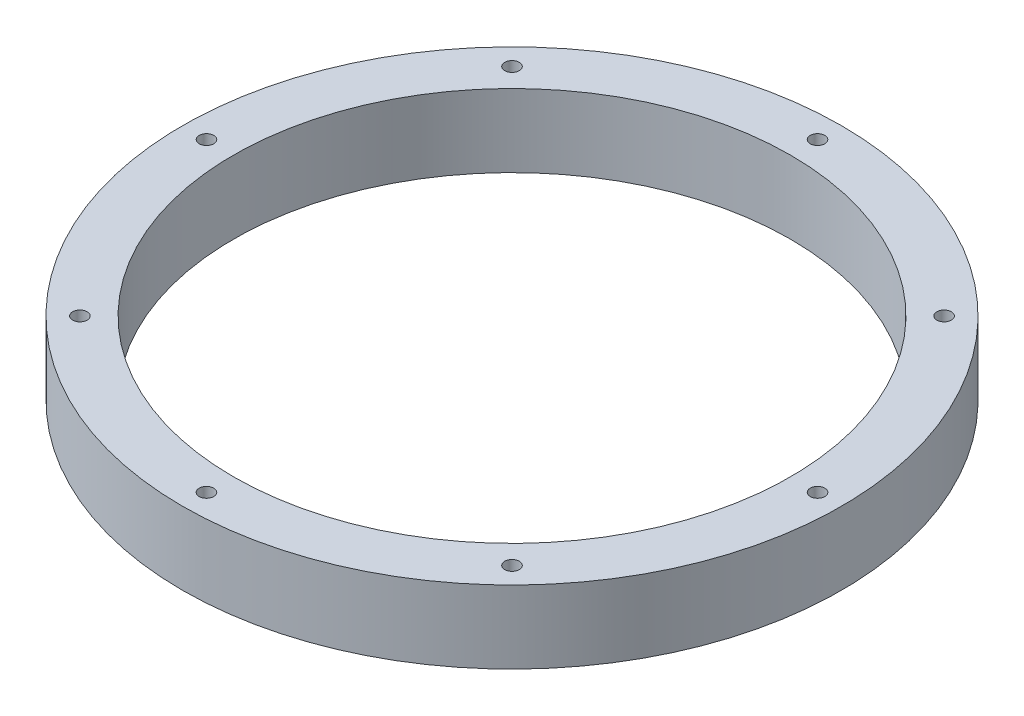
ISO-10303-21;
HEADER;
FILE_DESCRIPTION(('STEP AP214'),'2;1');
FILE_NAME('part.step','',(''),(''),'','','');
FILE_SCHEMA(('AUTOMOTIVE_DESIGN { 1 0 10303 214 1 1 1 1 }'));
ENDSEC;
DATA;
#1=APPLICATION_CONTEXT('core data for automotive mechanical design processes');
#2=APPLICATION_PROTOCOL_DEFINITION('international standard','automotive_design',2000,#1);
#3=PRODUCT_CONTEXT('',#1,'mechanical');
#4=PRODUCT('Part','Part','',(#3));
#5=PRODUCT_RELATED_PRODUCT_CATEGORY('part','',(#4));
#6=PRODUCT_DEFINITION_FORMATION('','',#4);
#7=PRODUCT_DEFINITION_CONTEXT('part definition',#1,'design');
#8=PRODUCT_DEFINITION('design','',#6,#7);
#9=PRODUCT_DEFINITION_SHAPE('','',#8);
#10=(LENGTH_UNIT() NAMED_UNIT(*) SI_UNIT(.MILLI.,.METRE.));
#11=(NAMED_UNIT(*) PLANE_ANGLE_UNIT() SI_UNIT($,.RADIAN.));
#12=(NAMED_UNIT(*) SI_UNIT($,.STERADIAN.) SOLID_ANGLE_UNIT());
#13=UNCERTAINTY_MEASURE_WITH_UNIT(LENGTH_MEASURE(1.E-05),#10,'distance_accuracy_value','');
#14=(GEOMETRIC_REPRESENTATION_CONTEXT(3) GLOBAL_UNCERTAINTY_ASSIGNED_CONTEXT((#13)) GLOBAL_UNIT_ASSIGNED_CONTEXT((#10,
#11,#12)) REPRESENTATION_CONTEXT('',''));
#15=CARTESIAN_POINT('',(0.,0.,0.));
#16=DIRECTION('',(0.,0.,1.));
#17=DIRECTION('',(1.,0.,0.));
#18=AXIS2_PLACEMENT_3D('',#15,#16,#17);
#19=CARTESIAN_POINT('',(0.,0.,0.));
#20=DIRECTION('',(0.,-1.,0.));
#21=DIRECTION('',(0.,0.,-1.));
#22=AXIS2_PLACEMENT_3D('',#19,#20,#21);
#23=CYLINDRICAL_SURFACE('',#22,76.5);
#24=CARTESIAN_POINT('',(0.,0.,0.));
#25=DIRECTION('',(0.,-1.,0.));
#26=DIRECTION('',(0.,0.,-1.));
#27=AXIS2_PLACEMENT_3D('',#24,#25,#26);
#28=CIRCLE('',#27,76.5);
#29=CARTESIAN_POINT('',(0.,0.,-76.5));
#30=VERTEX_POINT('',#29);
#31=EDGE_CURVE('E53',#30,#30,#28,.T.);
#32=ORIENTED_EDGE('',*,*,#31,.T.);
#33=EDGE_LOOP('',(#32));
#34=FACE_BOUND('',#33,.T.);
#35=CARTESIAN_POINT('',(0.,20.,0.));
#36=DIRECTION('',(0.,-1.,0.));
#37=DIRECTION('',(0.,0.,-1.));
#38=AXIS2_PLACEMENT_3D('',#35,#36,#37);
#39=CIRCLE('',#38,76.5);
#40=CARTESIAN_POINT('',(0.,20.,-76.5));
#41=VERTEX_POINT('',#40);
#42=EDGE_CURVE('E10',#41,#41,#39,.T.);
#43=ORIENTED_EDGE('',*,*,#42,.F.);
#44=EDGE_LOOP('',(#43));
#45=FACE_BOUND('',#44,.T.);
#46=ADVANCED_FACE('F39',(#34,#45),#23,.F.);
#47=CARTESIAN_POINT('',(76.5,20.,0.));
#48=DIRECTION('',(0.,1.,0.));
#49=DIRECTION('',(0.,0.,1.));
#50=AXIS2_PLACEMENT_3D('',#47,#48,#49);
#51=PLANE('',#50);
#52=CARTESIAN_POINT('',(-83.9,20.,0.));
#53=DIRECTION('',(0.,1.,0.));
#54=DIRECTION('',(0.,0.,1.));
#55=AXIS2_PLACEMENT_3D('',#52,#53,#54);
#56=CIRCLE('',#55,2.);
#57=CARTESIAN_POINT('',(-83.9,20.,2.));
#58=VERTEX_POINT('',#57);
#59=EDGE_CURVE('E101',#58,#58,#56,.T.);
#60=ORIENTED_EDGE('',*,*,#59,.F.);
#61=EDGE_LOOP('',(#60));
#62=FACE_BOUND('',#61,.T.);
#63=CARTESIAN_POINT('',(-59.3262589415513,20.,-59.3262589415513));
#64=DIRECTION('',(0.,1.,0.));
#65=DIRECTION('',(0.,0.,1.));
#66=AXIS2_PLACEMENT_3D('',#63,#64,#65);
#67=CIRCLE('',#66,2.);
#68=CARTESIAN_POINT('',(-59.3262589415513,20.,-57.3262589415514));
#69=VERTEX_POINT('',#68);
#70=EDGE_CURVE('E98',#69,#69,#67,.T.);
#71=ORIENTED_EDGE('',*,*,#70,.F.);
#72=EDGE_LOOP('',(#71));
#73=FACE_BOUND('',#72,.T.);
#74=CARTESIAN_POINT('',(0.,20.,-83.9));
#75=DIRECTION('',(0.,1.,0.));
#76=DIRECTION('',(0.,0.,1.));
#77=AXIS2_PLACEMENT_3D('',#74,#75,#76);
#78=CIRCLE('',#77,2.);
#79=CARTESIAN_POINT('',(0.,20.,-81.9));
#80=VERTEX_POINT('',#79);
#81=EDGE_CURVE('E92',#80,#80,#78,.T.);
#82=ORIENTED_EDGE('',*,*,#81,.F.);
#83=EDGE_LOOP('',(#82));
#84=FACE_BOUND('',#83,.T.);
#85=CARTESIAN_POINT('',(59.3262589415513,20.,-59.3262589415513));
#86=DIRECTION('',(0.,1.,0.));
#87=DIRECTION('',(0.,0.,1.));
#88=AXIS2_PLACEMENT_3D('',#85,#86,#87);
#89=CIRCLE('',#88,1.99999999999999);
#90=CARTESIAN_POINT('',(59.3262589415513,20.,-57.3262589415514));
#91=VERTEX_POINT('',#90);
#92=EDGE_CURVE('E86',#91,#91,#89,.T.);
#93=ORIENTED_EDGE('',*,*,#92,.F.);
#94=EDGE_LOOP('',(#93));
#95=FACE_BOUND('',#94,.T.);
#96=CARTESIAN_POINT('',(83.9,20.,0.));
#97=DIRECTION('',(0.,1.,0.));
#98=DIRECTION('',(0.,0.,1.));
#99=AXIS2_PLACEMENT_3D('',#96,#97,#98);
#100=CIRCLE('',#99,1.99999999999998);
#101=CARTESIAN_POINT('',(83.9,20.,1.99999999999997));
#102=VERTEX_POINT('',#101);
#103=EDGE_CURVE('E80',#102,#102,#100,.T.);
#104=ORIENTED_EDGE('',*,*,#103,.F.);
#105=EDGE_LOOP('',(#104));
#106=FACE_BOUND('',#105,.T.);
#107=CARTESIAN_POINT('',(59.3262589415514,20.,59.3262589415513));
#108=DIRECTION('',(0.,1.,0.));
#109=DIRECTION('',(0.,0.,1.));
#110=AXIS2_PLACEMENT_3D('',#107,#108,#109);
#111=CIRCLE('',#110,2.);
#112=CARTESIAN_POINT('',(59.3262589415514,20.,61.3262589415513));
#113=VERTEX_POINT('',#112);
#114=EDGE_CURVE('E74',#113,#113,#111,.T.);
#115=ORIENTED_EDGE('',*,*,#114,.F.);
#116=EDGE_LOOP('',(#115));
#117=FACE_BOUND('',#116,.T.);
#118=CARTESIAN_POINT('',(0.,20.,83.9));
#119=DIRECTION('',(0.,1.,0.));
#120=DIRECTION('',(0.,0.,1.));
#121=AXIS2_PLACEMENT_3D('',#118,#119,#120);
#122=CIRCLE('',#121,1.99999999999999);
#123=CARTESIAN_POINT('',(0.,20.,85.9));
#124=VERTEX_POINT('',#123);
#125=EDGE_CURVE('E68',#124,#124,#122,.T.);
#126=ORIENTED_EDGE('',*,*,#125,.F.);
#127=EDGE_LOOP('',(#126));
#128=FACE_BOUND('',#127,.T.);
#129=CARTESIAN_POINT('',(-59.3262589415514,20.,59.3262589415513));
#130=DIRECTION('',(0.,1.,0.));
#131=DIRECTION('',(0.,0.,1.));
#132=AXIS2_PLACEMENT_3D('',#129,#130,#131);
#133=CIRCLE('',#132,2.);
#134=CARTESIAN_POINT('',(-59.3262589415514,20.,61.3262589415513));
#135=VERTEX_POINT('',#134);
#136=EDGE_CURVE('E62',#135,#135,#133,.T.);
#137=ORIENTED_EDGE('',*,*,#136,.F.);
#138=EDGE_LOOP('',(#137));
#139=FACE_BOUND('',#138,.T.);
#140=ORIENTED_EDGE('',*,*,#42,.T.);
#141=EDGE_LOOP('',(#140));
#142=FACE_BOUND('',#141,.T.);
#143=CARTESIAN_POINT('',(0.,20.,0.));
#144=DIRECTION('',(0.,-1.,0.));
#145=DIRECTION('',(0.,0.,-1.));
#146=AXIS2_PLACEMENT_3D('',#143,#144,#145);
#147=CIRCLE('',#146,90.5);
#148=CARTESIAN_POINT('',(0.,20.,-90.5));
#149=VERTEX_POINT('',#148);
#150=EDGE_CURVE('E45',#149,#149,#147,.T.);
#151=ORIENTED_EDGE('',*,*,#150,.F.);
#152=EDGE_LOOP('',(#151));
#153=FACE_BOUND('',#152,.T.);
#154=ADVANCED_FACE('F117',(#62,#73,#84,#95,#106,#117,#128,#139,#142,#153),#51,.T.);
#155=CARTESIAN_POINT('',(0.,0.,0.));
#156=DIRECTION('',(0.,-1.,0.));
#157=DIRECTION('',(0.,0.,-1.));
#158=AXIS2_PLACEMENT_3D('',#155,#156,#157);
#159=CYLINDRICAL_SURFACE('',#158,90.5);
#160=ORIENTED_EDGE('',*,*,#150,.T.);
#161=EDGE_LOOP('',(#160));
#162=FACE_BOUND('',#161,.T.);
#163=CARTESIAN_POINT('',(0.,0.,0.));
#164=DIRECTION('',(0.,-1.,0.));
#165=DIRECTION('',(0.,0.,-1.));
#166=AXIS2_PLACEMENT_3D('',#163,#164,#165);
#167=CIRCLE('',#166,90.5);
#168=CARTESIAN_POINT('',(0.,0.,-90.5));
#169=VERTEX_POINT('',#168);
#170=EDGE_CURVE('E49',#169,#169,#167,.T.);
#171=ORIENTED_EDGE('',*,*,#170,.F.);
#172=EDGE_LOOP('',(#171));
#173=FACE_BOUND('',#172,.T.);
#174=ADVANCED_FACE('F120',(#162,#173),#159,.T.);
#175=CARTESIAN_POINT('',(76.5,0.,0.));
#176=DIRECTION('',(0.,-1.,0.));
#177=DIRECTION('',(0.,0.,-1.));
#178=AXIS2_PLACEMENT_3D('',#175,#176,#177);
#179=PLANE('',#178);
#180=CARTESIAN_POINT('',(-83.9,0.,0.));
#181=DIRECTION('',(0.,1.,0.));
#182=DIRECTION('',(0.,0.,1.));
#183=AXIS2_PLACEMENT_3D('',#180,#181,#182);
#184=CIRCLE('',#183,2.);
#185=CARTESIAN_POINT('',(-83.9,0.,2.));
#186=VERTEX_POINT('',#185);
#187=EDGE_CURVE('E58',#186,#186,#184,.T.);
#188=ORIENTED_EDGE('',*,*,#187,.T.);
#189=EDGE_LOOP('',(#188));
#190=FACE_BOUND('',#189,.T.);
#191=CARTESIAN_POINT('',(-59.3262589415513,0.,-59.3262589415513));
#192=DIRECTION('',(0.,1.,0.));
#193=DIRECTION('',(0.,0.,1.));
#194=AXIS2_PLACEMENT_3D('',#191,#192,#193);
#195=CIRCLE('',#194,2.);
#196=CARTESIAN_POINT('',(-59.3262589415513,0.,-57.3262589415514));
#197=VERTEX_POINT('',#196);
#198=EDGE_CURVE('E95',#197,#197,#195,.T.);
#199=ORIENTED_EDGE('',*,*,#198,.T.);
#200=EDGE_LOOP('',(#199));
#201=FACE_BOUND('',#200,.T.);
#202=CARTESIAN_POINT('',(0.,0.,-83.9));
#203=DIRECTION('',(0.,1.,0.));
#204=DIRECTION('',(0.,0.,1.));
#205=AXIS2_PLACEMENT_3D('',#202,#203,#204);
#206=CIRCLE('',#205,2.);
#207=CARTESIAN_POINT('',(0.,0.,-81.9));
#208=VERTEX_POINT('',#207);
#209=EDGE_CURVE('E89',#208,#208,#206,.T.);
#210=ORIENTED_EDGE('',*,*,#209,.T.);
#211=EDGE_LOOP('',(#210));
#212=FACE_BOUND('',#211,.T.);
#213=CARTESIAN_POINT('',(59.3262589415513,0.,-59.3262589415513));
#214=DIRECTION('',(0.,1.,0.));
#215=DIRECTION('',(0.,0.,1.));
#216=AXIS2_PLACEMENT_3D('',#213,#214,#215);
#217=CIRCLE('',#216,1.99999999999999);
#218=CARTESIAN_POINT('',(59.3262589415513,0.,-57.3262589415514));
#219=VERTEX_POINT('',#218);
#220=EDGE_CURVE('E83',#219,#219,#217,.T.);
#221=ORIENTED_EDGE('',*,*,#220,.T.);
#222=EDGE_LOOP('',(#221));
#223=FACE_BOUND('',#222,.T.);
#224=CARTESIAN_POINT('',(83.9,0.,0.));
#225=DIRECTION('',(0.,1.,0.));
#226=DIRECTION('',(0.,0.,1.));
#227=AXIS2_PLACEMENT_3D('',#224,#225,#226);
#228=CIRCLE('',#227,1.99999999999998);
#229=CARTESIAN_POINT('',(83.9,0.,1.99999999999997));
#230=VERTEX_POINT('',#229);
#231=EDGE_CURVE('E77',#230,#230,#228,.T.);
#232=ORIENTED_EDGE('',*,*,#231,.T.);
#233=EDGE_LOOP('',(#232));
#234=FACE_BOUND('',#233,.T.);
#235=CARTESIAN_POINT('',(59.3262589415514,0.,59.3262589415513));
#236=DIRECTION('',(0.,1.,0.));
#237=DIRECTION('',(0.,0.,1.));
#238=AXIS2_PLACEMENT_3D('',#235,#236,#237);
#239=CIRCLE('',#238,2.);
#240=CARTESIAN_POINT('',(59.3262589415514,0.,61.3262589415513));
#241=VERTEX_POINT('',#240);
#242=EDGE_CURVE('E71',#241,#241,#239,.T.);
#243=ORIENTED_EDGE('',*,*,#242,.T.);
#244=EDGE_LOOP('',(#243));
#245=FACE_BOUND('',#244,.T.);
#246=CARTESIAN_POINT('',(0.,0.,83.9));
#247=DIRECTION('',(0.,1.,0.));
#248=DIRECTION('',(0.,0.,1.));
#249=AXIS2_PLACEMENT_3D('',#246,#247,#248);
#250=CIRCLE('',#249,1.99999999999999);
#251=CARTESIAN_POINT('',(0.,0.,85.9));
#252=VERTEX_POINT('',#251);
#253=EDGE_CURVE('E65',#252,#252,#250,.T.);
#254=ORIENTED_EDGE('',*,*,#253,.T.);
#255=EDGE_LOOP('',(#254));
#256=FACE_BOUND('',#255,.T.);
#257=CARTESIAN_POINT('',(-59.3262589415514,0.,59.3262589415513));
#258=DIRECTION('',(0.,1.,0.));
#259=DIRECTION('',(0.,0.,1.));
#260=AXIS2_PLACEMENT_3D('',#257,#258,#259);
#261=CIRCLE('',#260,2.);
#262=CARTESIAN_POINT('',(-59.3262589415514,0.,61.3262589415513));
#263=VERTEX_POINT('',#262);
#264=EDGE_CURVE('E59',#263,#263,#261,.T.);
#265=ORIENTED_EDGE('',*,*,#264,.T.);
#266=EDGE_LOOP('',(#265));
#267=FACE_BOUND('',#266,.T.);
#268=ORIENTED_EDGE('',*,*,#170,.T.);
#269=EDGE_LOOP('',(#268));
#270=FACE_BOUND('',#269,.T.);
#271=ORIENTED_EDGE('',*,*,#31,.F.);
#272=EDGE_LOOP('',(#271));
#273=FACE_BOUND('',#272,.T.);
#274=ADVANCED_FACE('F107',(#190,#201,#212,#223,#234,#245,#256,#267,#270,#273),#179,.T.);
#275=CARTESIAN_POINT('',(-59.3262589415514,0.,59.3262589415513));
#276=DIRECTION('',(0.,1.,0.));
#277=DIRECTION('',(0.,0.,1.));
#278=AXIS2_PLACEMENT_3D('',#275,#276,#277);
#279=CYLINDRICAL_SURFACE('',#278,2.);
#280=ORIENTED_EDGE('',*,*,#264,.F.);
#281=EDGE_LOOP('',(#280));
#282=FACE_BOUND('',#281,.T.);
#283=ORIENTED_EDGE('',*,*,#136,.T.);
#284=EDGE_LOOP('',(#283));
#285=FACE_BOUND('',#284,.T.);
#286=ADVANCED_FACE('F136',(#282,#285),#279,.F.);
#287=CARTESIAN_POINT('',(0.,0.,83.9));
#288=DIRECTION('',(0.,1.,0.));
#289=DIRECTION('',(0.,0.,1.));
#290=AXIS2_PLACEMENT_3D('',#287,#288,#289);
#291=CYLINDRICAL_SURFACE('',#290,1.99999999999999);
#292=ORIENTED_EDGE('',*,*,#253,.F.);
#293=EDGE_LOOP('',(#292));
#294=FACE_BOUND('',#293,.T.);
#295=ORIENTED_EDGE('',*,*,#125,.T.);
#296=EDGE_LOOP('',(#295));
#297=FACE_BOUND('',#296,.T.);
#298=ADVANCED_FACE('F138',(#294,#297),#291,.F.);
#299=CARTESIAN_POINT('',(59.3262589415514,0.,59.3262589415513));
#300=DIRECTION('',(0.,1.,0.));
#301=DIRECTION('',(0.,0.,1.));
#302=AXIS2_PLACEMENT_3D('',#299,#300,#301);
#303=CYLINDRICAL_SURFACE('',#302,2.);
#304=ORIENTED_EDGE('',*,*,#242,.F.);
#305=EDGE_LOOP('',(#304));
#306=FACE_BOUND('',#305,.T.);
#307=ORIENTED_EDGE('',*,*,#114,.T.);
#308=EDGE_LOOP('',(#307));
#309=FACE_BOUND('',#308,.T.);
#310=ADVANCED_FACE('F145',(#306,#309),#303,.F.);
#311=CARTESIAN_POINT('',(83.9,0.,0.));
#312=DIRECTION('',(0.,1.,0.));
#313=DIRECTION('',(0.,0.,1.));
#314=AXIS2_PLACEMENT_3D('',#311,#312,#313);
#315=CYLINDRICAL_SURFACE('',#314,1.99999999999998);
#316=ORIENTED_EDGE('',*,*,#231,.F.);
#317=EDGE_LOOP('',(#316));
#318=FACE_BOUND('',#317,.T.);
#319=ORIENTED_EDGE('',*,*,#103,.T.);
#320=EDGE_LOOP('',(#319));
#321=FACE_BOUND('',#320,.T.);
#322=ADVANCED_FACE('F194',(#318,#321),#315,.F.);
#323=CARTESIAN_POINT('',(59.3262589415513,0.,-59.3262589415513));
#324=DIRECTION('',(0.,1.,0.));
#325=DIRECTION('',(0.,0.,1.));
#326=AXIS2_PLACEMENT_3D('',#323,#324,#325);
#327=CYLINDRICAL_SURFACE('',#326,1.99999999999999);
#328=ORIENTED_EDGE('',*,*,#220,.F.);
#329=EDGE_LOOP('',(#328));
#330=FACE_BOUND('',#329,.T.);
#331=ORIENTED_EDGE('',*,*,#92,.T.);
#332=EDGE_LOOP('',(#331));
#333=FACE_BOUND('',#332,.T.);
#334=ADVANCED_FACE('F204',(#330,#333),#327,.F.);
#335=CARTESIAN_POINT('',(0.,0.,-83.9));
#336=DIRECTION('',(0.,1.,0.));
#337=DIRECTION('',(0.,0.,1.));
#338=AXIS2_PLACEMENT_3D('',#335,#336,#337);
#339=CYLINDRICAL_SURFACE('',#338,2.);
#340=ORIENTED_EDGE('',*,*,#209,.F.);
#341=EDGE_LOOP('',(#340));
#342=FACE_BOUND('',#341,.T.);
#343=ORIENTED_EDGE('',*,*,#81,.T.);
#344=EDGE_LOOP('',(#343));
#345=FACE_BOUND('',#344,.T.);
#346=ADVANCED_FACE('F214',(#342,#345),#339,.F.);
#347=CARTESIAN_POINT('',(-59.3262589415513,0.,-59.3262589415513));
#348=DIRECTION('',(0.,1.,0.));
#349=DIRECTION('',(0.,0.,1.));
#350=AXIS2_PLACEMENT_3D('',#347,#348,#349);
#351=CYLINDRICAL_SURFACE('',#350,2.);
#352=ORIENTED_EDGE('',*,*,#198,.F.);
#353=EDGE_LOOP('',(#352));
#354=FACE_BOUND('',#353,.T.);
#355=ORIENTED_EDGE('',*,*,#70,.T.);
#356=EDGE_LOOP('',(#355));
#357=FACE_BOUND('',#356,.T.);
#358=ADVANCED_FACE('F113',(#354,#357),#351,.F.);
#359=CARTESIAN_POINT('',(-83.9,0.,0.));
#360=DIRECTION('',(0.,1.,0.));
#361=DIRECTION('',(0.,0.,1.));
#362=AXIS2_PLACEMENT_3D('',#359,#360,#361);
#363=CYLINDRICAL_SURFACE('',#362,2.);
#364=ORIENTED_EDGE('',*,*,#187,.F.);
#365=EDGE_LOOP('',(#364));
#366=FACE_BOUND('',#365,.T.);
#367=ORIENTED_EDGE('',*,*,#59,.T.);
#368=EDGE_LOOP('',(#367));
#369=FACE_BOUND('',#368,.T.);
#370=ADVANCED_FACE('F110',(#366,#369),#363,.F.);
#371=CLOSED_SHELL('',(#46,#154,#174,#274,#286,#298,#310,#322,#334,#346,#358,#370));
#372=MANIFOLD_SOLID_BREP('B2',#371);
#373=ADVANCED_BREP_SHAPE_REPRESENTATION('',(#18,#372),#14);
#374=SHAPE_DEFINITION_REPRESENTATION(#9,#373);
ENDSEC;
END-ISO-10303-21;
